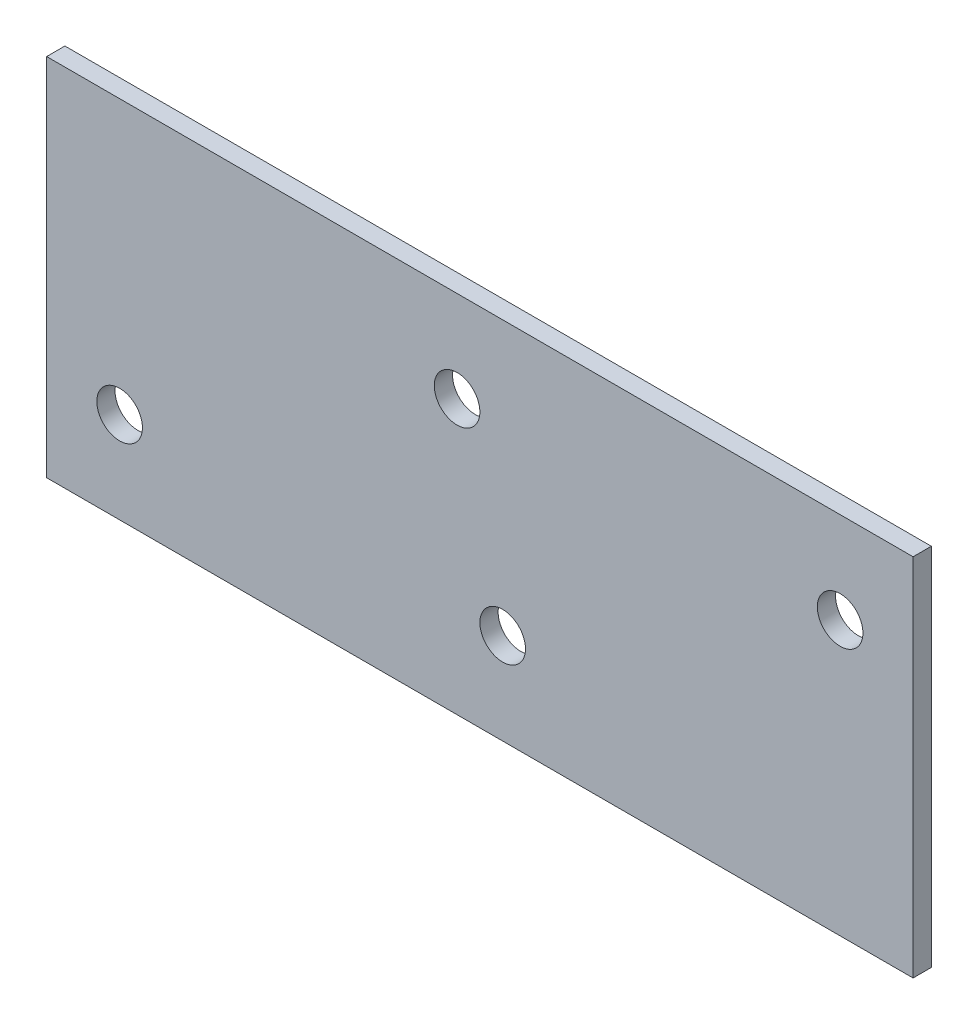
ISO-10303-21;
HEADER;
FILE_DESCRIPTION(('STEP AP214'),'2;1');
FILE_NAME('part.step','',(''),(''),'','','');
FILE_SCHEMA(('AUTOMOTIVE_DESIGN { 1 0 10303 214 1 1 1 1 }'));
ENDSEC;
DATA;
#1=APPLICATION_CONTEXT('core data for automotive mechanical design processes');
#2=APPLICATION_PROTOCOL_DEFINITION('international standard','automotive_design',2000,#1);
#3=PRODUCT_CONTEXT('',#1,'mechanical');
#4=PRODUCT('Part','Part','',(#3));
#5=PRODUCT_RELATED_PRODUCT_CATEGORY('part','',(#4));
#6=PRODUCT_DEFINITION_FORMATION('','',#4);
#7=PRODUCT_DEFINITION_CONTEXT('part definition',#1,'design');
#8=PRODUCT_DEFINITION('design','',#6,#7);
#9=PRODUCT_DEFINITION_SHAPE('','',#8);
#10=(LENGTH_UNIT() NAMED_UNIT(*) SI_UNIT(.MILLI.,.METRE.));
#11=(NAMED_UNIT(*) PLANE_ANGLE_UNIT() SI_UNIT($,.RADIAN.));
#12=(NAMED_UNIT(*) SI_UNIT($,.STERADIAN.) SOLID_ANGLE_UNIT());
#13=UNCERTAINTY_MEASURE_WITH_UNIT(LENGTH_MEASURE(1.E-05),#10,'distance_accuracy_value','');
#14=(GEOMETRIC_REPRESENTATION_CONTEXT(3) GLOBAL_UNCERTAINTY_ASSIGNED_CONTEXT((#13)) GLOBAL_UNIT_ASSIGNED_CONTEXT((#10,
#11,#12)) REPRESENTATION_CONTEXT('',''));
#15=CARTESIAN_POINT('',(0.,0.,0.));
#16=DIRECTION('',(0.,0.,1.));
#17=DIRECTION('',(1.,0.,0.));
#18=AXIS2_PLACEMENT_3D('',#15,#16,#17);
#19=CARTESIAN_POINT('',(0.,0.,2.));
#20=DIRECTION('',(0.,0.,-1.));
#21=DIRECTION('',(-1.,0.,0.));
#22=AXIS2_PLACEMENT_3D('',#19,#20,#21);
#23=PLANE('',#22);
#24=DIRECTION('',(0.,-1.,0.));
#25=VECTOR('',#24,1.);
#26=CARTESIAN_POINT('',(-37.5,20.,2.));
#27=LINE('',#26,#25);
#28=CARTESIAN_POINT('',(-37.5,20.,2.));
#29=VERTEX_POINT('',#28);
#30=CARTESIAN_POINT('',(-37.5,-20.,2.));
#31=VERTEX_POINT('',#30);
#32=EDGE_CURVE('E89',#29,#31,#27,.T.);
#33=ORIENTED_EDGE('',*,*,#32,.T.);
#34=DIRECTION('',(1.,0.,0.));
#35=VECTOR('',#34,1.);
#36=CARTESIAN_POINT('',(57.5,-20.,2.));
#37=LINE('',#36,#35);
#38=CARTESIAN_POINT('',(57.5,-20.,2.));
#39=VERTEX_POINT('',#38);
#40=EDGE_CURVE('E84',#31,#39,#37,.T.);
#41=ORIENTED_EDGE('',*,*,#40,.T.);
#42=DIRECTION('',(0.,1.,0.));
#43=VECTOR('',#42,1.);
#44=CARTESIAN_POINT('',(57.5,20.,2.));
#45=LINE('',#44,#43);
#46=CARTESIAN_POINT('',(57.5,20.,2.));
#47=VERTEX_POINT('',#46);
#48=EDGE_CURVE('E87',#39,#47,#45,.T.);
#49=ORIENTED_EDGE('',*,*,#48,.T.);
#50=DIRECTION('',(-1.,0.,0.));
#51=VECTOR('',#50,1.);
#52=CARTESIAN_POINT('',(57.5,20.,2.));
#53=LINE('',#52,#51);
#54=EDGE_CURVE('E54',#47,#29,#53,.T.);
#55=ORIENTED_EDGE('',*,*,#54,.T.);
#56=EDGE_LOOP('',(#33,#41,#49,#55));
#57=FACE_BOUND('',#56,.T.);
#58=CARTESIAN_POINT('',(-29.5,-9.99999999999999,2.));
#59=DIRECTION('',(0.,0.,1.));
#60=DIRECTION('',(-1.,0.,0.));
#61=AXIS2_PLACEMENT_3D('',#58,#59,#60);
#62=CIRCLE('',#61,2.49999999999999);
#63=CARTESIAN_POINT('',(-32.,-9.99999999999999,2.));
#64=VERTEX_POINT('',#63);
#65=EDGE_CURVE('E104',#64,#64,#62,.T.);
#66=ORIENTED_EDGE('',*,*,#65,.F.);
#67=EDGE_LOOP('',(#66));
#68=FACE_BOUND('',#67,.T.);
#69=CARTESIAN_POINT('',(7.49999999999999,9.99999999999998,2.));
#70=DIRECTION('',(0.,0.,1.));
#71=DIRECTION('',(1.,0.,0.));
#72=AXIS2_PLACEMENT_3D('',#69,#70,#71);
#73=CIRCLE('',#72,2.5);
#74=CARTESIAN_POINT('',(9.99999999999999,9.99999999999998,2.));
#75=VERTEX_POINT('',#74);
#76=EDGE_CURVE('E119',#75,#75,#73,.T.);
#77=ORIENTED_EDGE('',*,*,#76,.F.);
#78=EDGE_LOOP('',(#77));
#79=FACE_BOUND('',#78,.T.);
#80=CARTESIAN_POINT('',(12.5,-9.99999999999999,2.));
#81=DIRECTION('',(0.,0.,1.));
#82=DIRECTION('',(1.,0.,0.));
#83=AXIS2_PLACEMENT_3D('',#80,#81,#82);
#84=CIRCLE('',#83,2.5);
#85=CARTESIAN_POINT('',(15.,-9.99999999999999,2.));
#86=VERTEX_POINT('',#85);
#87=EDGE_CURVE('E125',#86,#86,#84,.T.);
#88=ORIENTED_EDGE('',*,*,#87,.F.);
#89=EDGE_LOOP('',(#88));
#90=FACE_BOUND('',#89,.T.);
#91=CARTESIAN_POINT('',(49.5,9.99999999999998,2.));
#92=DIRECTION('',(0.,0.,1.));
#93=DIRECTION('',(-1.,0.,0.));
#94=AXIS2_PLACEMENT_3D('',#91,#92,#93);
#95=CIRCLE('',#94,2.49999999999999);
#96=CARTESIAN_POINT('',(47.,9.99999999999998,2.));
#97=VERTEX_POINT('',#96);
#98=EDGE_CURVE('E131',#97,#97,#95,.T.);
#99=ORIENTED_EDGE('',*,*,#98,.F.);
#100=EDGE_LOOP('',(#99));
#101=FACE_BOUND('',#100,.T.);
#102=ADVANCED_FACE('F37',(#57,#68,#79,#90,#101),#23,.F.);
#103=CARTESIAN_POINT('',(0.,0.,0.));
#104=DIRECTION('',(0.,0.,-1.));
#105=DIRECTION('',(-1.,0.,0.));
#106=AXIS2_PLACEMENT_3D('',#103,#104,#105);
#107=PLANE('',#106);
#108=CARTESIAN_POINT('',(12.5,-9.99999999999999,0.));
#109=DIRECTION('',(0.,0.,1.));
#110=DIRECTION('',(1.,0.,0.));
#111=AXIS2_PLACEMENT_3D('',#108,#109,#110);
#112=CIRCLE('',#111,2.5);
#113=CARTESIAN_POINT('',(15.,-9.99999999999999,0.));
#114=VERTEX_POINT('',#113);
#115=EDGE_CURVE('E128',#114,#114,#112,.T.);
#116=ORIENTED_EDGE('',*,*,#115,.T.);
#117=EDGE_LOOP('',(#116));
#118=FACE_BOUND('',#117,.T.);
#119=CARTESIAN_POINT('',(-29.5,-9.99999999999999,0.));
#120=DIRECTION('',(0.,0.,1.));
#121=DIRECTION('',(-1.,0.,0.));
#122=AXIS2_PLACEMENT_3D('',#119,#120,#121);
#123=CIRCLE('',#122,2.49999999999999);
#124=CARTESIAN_POINT('',(-32.,-9.99999999999999,0.));
#125=VERTEX_POINT('',#124);
#126=EDGE_CURVE('E116',#125,#125,#123,.T.);
#127=ORIENTED_EDGE('',*,*,#126,.T.);
#128=EDGE_LOOP('',(#127));
#129=FACE_BOUND('',#128,.T.);
#130=DIRECTION('',(0.,-1.,0.));
#131=VECTOR('',#130,1.);
#132=CARTESIAN_POINT('',(-37.5,20.,0.));
#133=LINE('',#132,#131);
#134=CARTESIAN_POINT('',(-37.5,20.,0.));
#135=VERTEX_POINT('',#134);
#136=CARTESIAN_POINT('',(-37.5,-20.,0.));
#137=VERTEX_POINT('',#136);
#138=EDGE_CURVE('E101',#135,#137,#133,.T.);
#139=ORIENTED_EDGE('',*,*,#138,.F.);
#140=DIRECTION('',(-1.,0.,0.));
#141=VECTOR('',#140,1.);
#142=CARTESIAN_POINT('',(57.5,20.,0.));
#143=LINE('',#142,#141);
#144=CARTESIAN_POINT('',(57.5,20.,0.));
#145=VERTEX_POINT('',#144);
#146=EDGE_CURVE('E77',#145,#135,#143,.T.);
#147=ORIENTED_EDGE('',*,*,#146,.F.);
#148=DIRECTION('',(0.,1.,0.));
#149=VECTOR('',#148,1.);
#150=CARTESIAN_POINT('',(57.5,20.,0.));
#151=LINE('',#150,#149);
#152=CARTESIAN_POINT('',(57.5,-20.,0.));
#153=VERTEX_POINT('',#152);
#154=EDGE_CURVE('E71',#153,#145,#151,.T.);
#155=ORIENTED_EDGE('',*,*,#154,.F.);
#156=DIRECTION('',(1.,0.,0.));
#157=VECTOR('',#156,1.);
#158=CARTESIAN_POINT('',(57.5,-20.,0.));
#159=LINE('',#158,#157);
#160=EDGE_CURVE('E93',#137,#153,#159,.T.);
#161=ORIENTED_EDGE('',*,*,#160,.F.);
#162=EDGE_LOOP('',(#139,#147,#155,#161));
#163=FACE_BOUND('',#162,.T.);
#164=CARTESIAN_POINT('',(7.49999999999999,9.99999999999998,0.));
#165=DIRECTION('',(0.,0.,1.));
#166=DIRECTION('',(1.,0.,0.));
#167=AXIS2_PLACEMENT_3D('',#164,#165,#166);
#168=CIRCLE('',#167,2.5);
#169=CARTESIAN_POINT('',(9.99999999999999,9.99999999999998,0.));
#170=VERTEX_POINT('',#169);
#171=EDGE_CURVE('E122',#170,#170,#168,.T.);
#172=ORIENTED_EDGE('',*,*,#171,.T.);
#173=EDGE_LOOP('',(#172));
#174=FACE_BOUND('',#173,.T.);
#175=CARTESIAN_POINT('',(49.5,9.99999999999998,0.));
#176=DIRECTION('',(0.,0.,1.));
#177=DIRECTION('',(-1.,0.,0.));
#178=AXIS2_PLACEMENT_3D('',#175,#176,#177);
#179=CIRCLE('',#178,2.49999999999999);
#180=CARTESIAN_POINT('',(47.,9.99999999999998,0.));
#181=VERTEX_POINT('',#180);
#182=EDGE_CURVE('E134',#181,#181,#179,.T.);
#183=ORIENTED_EDGE('',*,*,#182,.T.);
#184=EDGE_LOOP('',(#183));
#185=FACE_BOUND('',#184,.T.);
#186=ADVANCED_FACE('F112',(#118,#129,#163,#174,#185),#107,.T.);
#187=CARTESIAN_POINT('',(-37.5,20.,2.));
#188=DIRECTION('',(1.,0.,0.));
#189=DIRECTION('',(0.,1.,0.));
#190=AXIS2_PLACEMENT_3D('',#187,#188,#189);
#191=PLANE('',#190);
#192=ORIENTED_EDGE('',*,*,#138,.T.);
#193=DIRECTION('',(0.,0.,-1.));
#194=VECTOR('',#193,1.);
#195=CARTESIAN_POINT('',(-37.5,-20.,2.));
#196=LINE('',#195,#194);
#197=EDGE_CURVE('E11',#31,#137,#196,.T.);
#198=ORIENTED_EDGE('',*,*,#197,.F.);
#199=ORIENTED_EDGE('',*,*,#32,.F.);
#200=DIRECTION('',(0.,0.,-1.));
#201=VECTOR('',#200,1.);
#202=CARTESIAN_POINT('',(-37.5,20.,2.));
#203=LINE('',#202,#201);
#204=EDGE_CURVE('E97',#29,#135,#203,.T.);
#205=ORIENTED_EDGE('',*,*,#204,.T.);
#206=EDGE_LOOP('',(#192,#198,#199,#205));
#207=FACE_BOUND('',#206,.T.);
#208=ADVANCED_FACE('F39',(#207),#191,.F.);
#209=CARTESIAN_POINT('',(57.5,-20.,2.));
#210=DIRECTION('',(0.,1.,0.));
#211=DIRECTION('',(-1.,0.,0.));
#212=AXIS2_PLACEMENT_3D('',#209,#210,#211);
#213=PLANE('',#212);
#214=ORIENTED_EDGE('',*,*,#160,.T.);
#215=DIRECTION('',(0.,0.,-1.));
#216=VECTOR('',#215,1.);
#217=CARTESIAN_POINT('',(57.5,-20.,2.));
#218=LINE('',#217,#216);
#219=EDGE_CURVE('E46',#39,#153,#218,.T.);
#220=ORIENTED_EDGE('',*,*,#219,.F.);
#221=ORIENTED_EDGE('',*,*,#40,.F.);
#222=ORIENTED_EDGE('',*,*,#197,.T.);
#223=EDGE_LOOP('',(#214,#220,#221,#222));
#224=FACE_BOUND('',#223,.T.);
#225=ADVANCED_FACE('F92',(#224),#213,.F.);
#226=CARTESIAN_POINT('',(57.5,20.,2.));
#227=DIRECTION('',(-1.,0.,0.));
#228=DIRECTION('',(0.,0.,1.));
#229=AXIS2_PLACEMENT_3D('',#226,#227,#228);
#230=PLANE('',#229);
#231=ORIENTED_EDGE('',*,*,#154,.T.);
#232=DIRECTION('',(0.,0.,-1.));
#233=VECTOR('',#232,1.);
#234=CARTESIAN_POINT('',(57.5,20.,2.));
#235=LINE('',#234,#233);
#236=EDGE_CURVE('E94',#47,#145,#235,.T.);
#237=ORIENTED_EDGE('',*,*,#236,.F.);
#238=ORIENTED_EDGE('',*,*,#48,.F.);
#239=ORIENTED_EDGE('',*,*,#219,.T.);
#240=EDGE_LOOP('',(#231,#237,#238,#239));
#241=FACE_BOUND('',#240,.T.);
#242=ADVANCED_FACE('F95',(#241),#230,.F.);
#243=CARTESIAN_POINT('',(57.5,20.,2.));
#244=DIRECTION('',(0.,-1.,0.));
#245=DIRECTION('',(1.,0.,0.));
#246=AXIS2_PLACEMENT_3D('',#243,#244,#245);
#247=PLANE('',#246);
#248=ORIENTED_EDGE('',*,*,#146,.T.);
#249=ORIENTED_EDGE('',*,*,#204,.F.);
#250=ORIENTED_EDGE('',*,*,#54,.F.);
#251=ORIENTED_EDGE('',*,*,#236,.T.);
#252=EDGE_LOOP('',(#248,#249,#250,#251));
#253=FACE_BOUND('',#252,.T.);
#254=ADVANCED_FACE('F109',(#253),#247,.F.);
#255=CARTESIAN_POINT('',(-29.5,-9.99999999999999,2.));
#256=DIRECTION('',(0.,0.,-1.));
#257=DIRECTION('',(-1.,0.,0.));
#258=AXIS2_PLACEMENT_3D('',#255,#256,#257);
#259=CYLINDRICAL_SURFACE('',#258,2.49999999999999);
#260=ORIENTED_EDGE('',*,*,#65,.T.);
#261=EDGE_LOOP('',(#260));
#262=FACE_BOUND('',#261,.T.);
#263=ORIENTED_EDGE('',*,*,#126,.F.);
#264=EDGE_LOOP('',(#263));
#265=FACE_BOUND('',#264,.T.);
#266=ADVANCED_FACE('F151',(#262,#265),#259,.F.);
#267=CARTESIAN_POINT('',(7.49999999999999,9.99999999999998,2.));
#268=DIRECTION('',(0.,0.,-1.));
#269=DIRECTION('',(-1.,0.,0.));
#270=AXIS2_PLACEMENT_3D('',#267,#268,#269);
#271=CYLINDRICAL_SURFACE('',#270,2.5);
#272=ORIENTED_EDGE('',*,*,#76,.T.);
#273=EDGE_LOOP('',(#272));
#274=FACE_BOUND('',#273,.T.);
#275=ORIENTED_EDGE('',*,*,#171,.F.);
#276=EDGE_LOOP('',(#275));
#277=FACE_BOUND('',#276,.T.);
#278=ADVANCED_FACE('F197',(#274,#277),#271,.F.);
#279=CARTESIAN_POINT('',(12.5,-9.99999999999999,2.));
#280=DIRECTION('',(0.,0.,-1.));
#281=DIRECTION('',(-1.,0.,0.));
#282=AXIS2_PLACEMENT_3D('',#279,#280,#281);
#283=CYLINDRICAL_SURFACE('',#282,2.5);
#284=ORIENTED_EDGE('',*,*,#87,.T.);
#285=EDGE_LOOP('',(#284));
#286=FACE_BOUND('',#285,.T.);
#287=ORIENTED_EDGE('',*,*,#115,.F.);
#288=EDGE_LOOP('',(#287));
#289=FACE_BOUND('',#288,.T.);
#290=ADVANCED_FACE('F205',(#286,#289),#283,.F.);
#291=CARTESIAN_POINT('',(49.5,9.99999999999998,2.));
#292=DIRECTION('',(0.,0.,-1.));
#293=DIRECTION('',(-1.,0.,0.));
#294=AXIS2_PLACEMENT_3D('',#291,#292,#293);
#295=CYLINDRICAL_SURFACE('',#294,2.49999999999999);
#296=ORIENTED_EDGE('',*,*,#98,.T.);
#297=EDGE_LOOP('',(#296));
#298=FACE_BOUND('',#297,.T.);
#299=ORIENTED_EDGE('',*,*,#182,.F.);
#300=EDGE_LOOP('',(#299));
#301=FACE_BOUND('',#300,.T.);
#302=ADVANCED_FACE('F140',(#298,#301),#295,.F.);
#303=CLOSED_SHELL('',(#102,#186,#208,#225,#242,#254,#266,#278,#290,#302));
#304=MANIFOLD_SOLID_BREP('B2',#303);
#305=ADVANCED_BREP_SHAPE_REPRESENTATION('',(#18,#304),#14);
#306=SHAPE_DEFINITION_REPRESENTATION(#9,#305);
ENDSEC;
END-ISO-10303-21;
